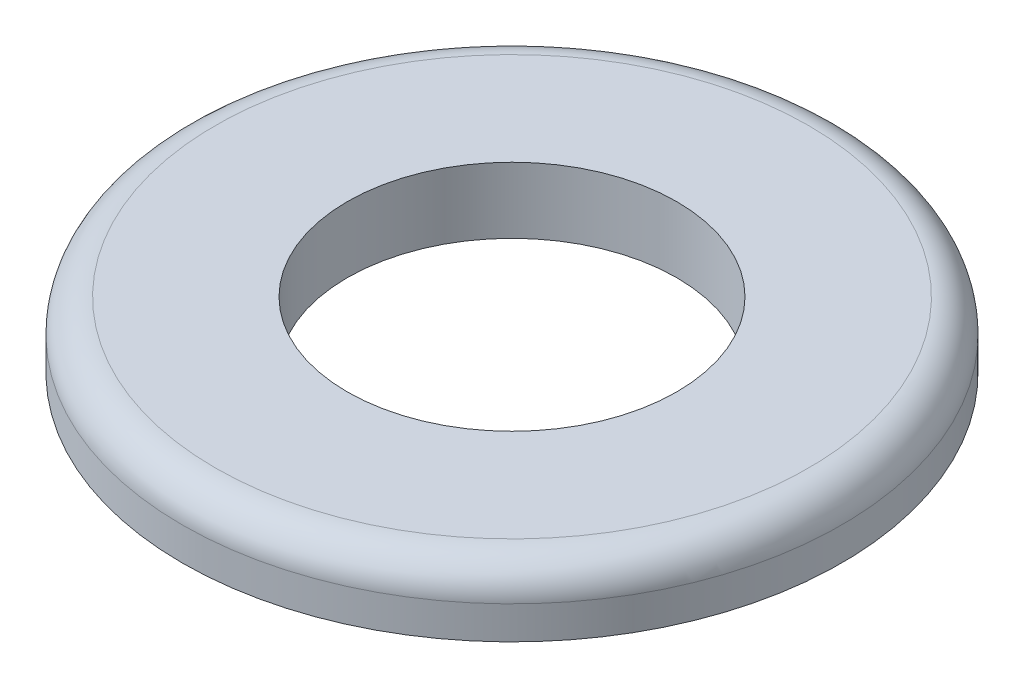
ISO-10303-21;
HEADER;
FILE_DESCRIPTION(('STEP AP214'),'2;1');
FILE_NAME('part.step','',(''),(''),'','','');
FILE_SCHEMA(('AUTOMOTIVE_DESIGN { 1 0 10303 214 1 1 1 1 }'));
ENDSEC;
DATA;
#1=APPLICATION_CONTEXT('core data for automotive mechanical design processes');
#2=APPLICATION_PROTOCOL_DEFINITION('international standard','automotive_design',2000,#1);
#3=PRODUCT_CONTEXT('',#1,'mechanical');
#4=PRODUCT('Part','Part','',(#3));
#5=PRODUCT_RELATED_PRODUCT_CATEGORY('part','',(#4));
#6=PRODUCT_DEFINITION_FORMATION('','',#4);
#7=PRODUCT_DEFINITION_CONTEXT('part definition',#1,'design');
#8=PRODUCT_DEFINITION('design','',#6,#7);
#9=PRODUCT_DEFINITION_SHAPE('','',#8);
#10=(LENGTH_UNIT() NAMED_UNIT(*) SI_UNIT(.MILLI.,.METRE.));
#11=(NAMED_UNIT(*) PLANE_ANGLE_UNIT() SI_UNIT($,.RADIAN.));
#12=(NAMED_UNIT(*) SI_UNIT($,.STERADIAN.) SOLID_ANGLE_UNIT());
#13=UNCERTAINTY_MEASURE_WITH_UNIT(LENGTH_MEASURE(1.E-05),#10,'distance_accuracy_value','');
#14=(GEOMETRIC_REPRESENTATION_CONTEXT(3) GLOBAL_UNCERTAINTY_ASSIGNED_CONTEXT((#13)) GLOBAL_UNIT_ASSIGNED_CONTEXT((#10,
#11,#12)) REPRESENTATION_CONTEXT('',''));
#15=CARTESIAN_POINT('',(0.,0.,0.));
#16=DIRECTION('',(0.,0.,1.));
#17=DIRECTION('',(1.,0.,0.));
#18=AXIS2_PLACEMENT_3D('',#15,#16,#17);
#19=CARTESIAN_POINT('',(0.,1.,0.));
#20=DIRECTION('',(0.,1.,0.));
#21=DIRECTION('',(0.,0.,1.));
#22=AXIS2_PLACEMENT_3D('',#19,#20,#21);
#23=PLANE('',#22);
#24=CARTESIAN_POINT('',(0.,1.,0.));
#25=DIRECTION('',(0.,1.,0.));
#26=DIRECTION('',(0.,0.,1.));
#27=AXIS2_PLACEMENT_3D('',#24,#25,#26);
#28=CIRCLE('',#27,4.5);
#29=CARTESIAN_POINT('',(0.,1.,4.5));
#30=VERTEX_POINT('',#29);
#31=EDGE_CURVE('E40',#30,#30,#28,.T.);
#32=ORIENTED_EDGE('',*,*,#31,.T.);
#33=EDGE_LOOP('',(#32));
#34=FACE_BOUND('',#33,.T.);
#35=CARTESIAN_POINT('',(0.,1.,0.));
#36=DIRECTION('',(0.,1.,0.));
#37=DIRECTION('',(0.,0.,1.));
#38=AXIS2_PLACEMENT_3D('',#35,#36,#37);
#39=CIRCLE('',#38,2.5);
#40=CARTESIAN_POINT('',(0.,1.,2.5));
#41=VERTEX_POINT('',#40);
#42=EDGE_CURVE('E48',#41,#41,#39,.T.);
#43=ORIENTED_EDGE('',*,*,#42,.F.);
#44=EDGE_LOOP('',(#43));
#45=FACE_BOUND('',#44,.T.);
#46=ADVANCED_FACE('F33',(#34,#45),#23,.T.);
#47=CARTESIAN_POINT('',(0.,0.,0.));
#48=DIRECTION('',(0.,1.,0.));
#49=DIRECTION('',(0.,0.,1.));
#50=AXIS2_PLACEMENT_3D('',#47,#48,#49);
#51=PLANE('',#50);
#52=CARTESIAN_POINT('',(0.,0.,0.));
#53=DIRECTION('',(0.,1.,0.));
#54=DIRECTION('',(0.,0.,1.));
#55=AXIS2_PLACEMENT_3D('',#52,#53,#54);
#56=CIRCLE('',#55,5.);
#57=CARTESIAN_POINT('',(0.,0.,5.));
#58=VERTEX_POINT('',#57);
#59=EDGE_CURVE('E44',#58,#58,#56,.T.);
#60=ORIENTED_EDGE('',*,*,#59,.F.);
#61=EDGE_LOOP('',(#60));
#62=FACE_BOUND('',#61,.T.);
#63=CARTESIAN_POINT('',(0.,0.,0.));
#64=DIRECTION('',(0.,1.,0.));
#65=DIRECTION('',(0.,0.,1.));
#66=AXIS2_PLACEMENT_3D('',#63,#64,#65);
#67=CIRCLE('',#66,2.5);
#68=CARTESIAN_POINT('',(0.,0.,2.5));
#69=VERTEX_POINT('',#68);
#70=EDGE_CURVE('E51',#69,#69,#67,.T.);
#71=ORIENTED_EDGE('',*,*,#70,.T.);
#72=EDGE_LOOP('',(#71));
#73=FACE_BOUND('',#72,.T.);
#74=ADVANCED_FACE('F61',(#62,#73),#51,.F.);
#75=CARTESIAN_POINT('',(0.,1.,0.));
#76=DIRECTION('',(0.,-1.,0.));
#77=DIRECTION('',(0.,0.,-1.));
#78=AXIS2_PLACEMENT_3D('',#75,#76,#77);
#79=CYLINDRICAL_SURFACE('',#78,5.);
#80=CARTESIAN_POINT('',(0.,0.5,0.));
#81=DIRECTION('',(0.,1.,0.));
#82=DIRECTION('',(0.,0.,1.));
#83=AXIS2_PLACEMENT_3D('',#80,#81,#82);
#84=CIRCLE('',#83,5.);
#85=CARTESIAN_POINT('',(0.,0.5,5.));
#86=VERTEX_POINT('',#85);
#87=EDGE_CURVE('E10',#86,#86,#84,.F.);
#88=ORIENTED_EDGE('',*,*,#87,.T.);
#89=EDGE_LOOP('',(#88));
#90=FACE_BOUND('',#89,.T.);
#91=ORIENTED_EDGE('',*,*,#59,.T.);
#92=EDGE_LOOP('',(#91));
#93=FACE_BOUND('',#92,.T.);
#94=ADVANCED_FACE('F66',(#90,#93),#79,.T.);
#95=CARTESIAN_POINT('',(0.,1.,0.));
#96=DIRECTION('',(0.,-1.,0.));
#97=DIRECTION('',(0.,0.,-1.));
#98=AXIS2_PLACEMENT_3D('',#95,#96,#97);
#99=CYLINDRICAL_SURFACE('',#98,2.5);
#100=ORIENTED_EDGE('',*,*,#42,.T.);
#101=EDGE_LOOP('',(#100));
#102=FACE_BOUND('',#101,.T.);
#103=ORIENTED_EDGE('',*,*,#70,.F.);
#104=EDGE_LOOP('',(#103));
#105=FACE_BOUND('',#104,.T.);
#106=ADVANCED_FACE('F57',(#102,#105),#99,.F.);
#107=CARTESIAN_POINT('',(0.,0.5,0.));
#108=DIRECTION('',(0.,1.,0.));
#109=DIRECTION('',(0.,0.,1.));
#110=AXIS2_PLACEMENT_3D('',#107,#108,#109);
#111=TOROIDAL_SURFACE('',#110,4.5,0.5);
#112=ORIENTED_EDGE('',*,*,#87,.F.);
#113=EDGE_LOOP('',(#112));
#114=FACE_BOUND('',#113,.T.);
#115=ORIENTED_EDGE('',*,*,#31,.F.);
#116=EDGE_LOOP('',(#115));
#117=FACE_BOUND('',#116,.T.);
#118=ADVANCED_FACE('F35',(#114,#117),#111,.T.);
#119=CLOSED_SHELL('',(#46,#74,#94,#106,#118));
#120=MANIFOLD_SOLID_BREP('B2',#119);
#121=ADVANCED_BREP_SHAPE_REPRESENTATION('',(#18,#120),#14);
#122=SHAPE_DEFINITION_REPRESENTATION(#9,#121);
ENDSEC;
END-ISO-10303-21;
